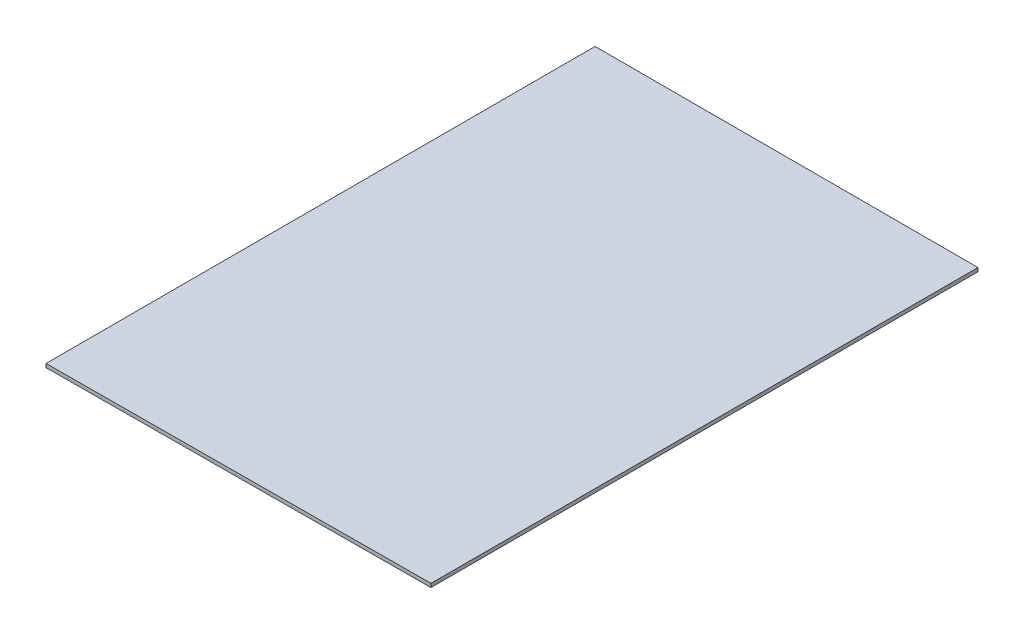
ISO-10303-21;
HEADER;
FILE_DESCRIPTION(('STEP AP214'),'2;1');
FILE_NAME('part.step','',(''),(''),'','','');
FILE_SCHEMA(('AUTOMOTIVE_DESIGN { 1 0 10303 214 1 1 1 1 }'));
ENDSEC;
DATA;
#1=APPLICATION_CONTEXT('core data for automotive mechanical design processes');
#2=APPLICATION_PROTOCOL_DEFINITION('international standard','automotive_design',2000,#1);
#3=PRODUCT_CONTEXT('',#1,'mechanical');
#4=PRODUCT('Part','Part','',(#3));
#5=PRODUCT_RELATED_PRODUCT_CATEGORY('part','',(#4));
#6=PRODUCT_DEFINITION_FORMATION('','',#4);
#7=PRODUCT_DEFINITION_CONTEXT('part definition',#1,'design');
#8=PRODUCT_DEFINITION('design','',#6,#7);
#9=PRODUCT_DEFINITION_SHAPE('','',#8);
#10=(LENGTH_UNIT() NAMED_UNIT(*) SI_UNIT(.MILLI.,.METRE.));
#11=(NAMED_UNIT(*) PLANE_ANGLE_UNIT() SI_UNIT($,.RADIAN.));
#12=(NAMED_UNIT(*) SI_UNIT($,.STERADIAN.) SOLID_ANGLE_UNIT());
#13=UNCERTAINTY_MEASURE_WITH_UNIT(LENGTH_MEASURE(1.E-05),#10,'distance_accuracy_value','');
#14=(GEOMETRIC_REPRESENTATION_CONTEXT(3) GLOBAL_UNCERTAINTY_ASSIGNED_CONTEXT((#13)) GLOBAL_UNIT_ASSIGNED_CONTEXT((#10,
#11,#12)) REPRESENTATION_CONTEXT('',''));
#15=CARTESIAN_POINT('',(0.,0.,0.));
#16=DIRECTION('',(0.,0.,1.));
#17=DIRECTION('',(1.,0.,0.));
#18=AXIS2_PLACEMENT_3D('',#15,#16,#17);
#19=CARTESIAN_POINT('',(-0.343304912611133,10.,-64.8870767216207));
#20=DIRECTION('',(-0.00529073160719021,0.,-0.999986003981586));
#21=DIRECTION('',(-0.999986003981586,0.,0.00529073160719021));
#22=AXIS2_PLACEMENT_3D('',#19,#20,#21);
#23=PLANE('',#22);
#24=DIRECTION('',(0.,1.,0.));
#25=VECTOR('',#24,1.);
#26=CARTESIAN_POINT('',(0.,10.,-64.8888930811945));
#27=LINE('',#26,#25);
#28=CARTESIAN_POINT('',(0.,10.,-64.8888930811945));
#29=VERTEX_POINT('',#28);
#30=CARTESIAN_POINT('',(0.,10.2,-64.8888930811945));
#31=VERTEX_POINT('',#30);
#32=EDGE_CURVE('E11',#29,#31,#27,.T.);
#33=ORIENTED_EDGE('',*,*,#32,.F.);
#34=DIRECTION('',(-0.999986003981586,0.,0.00529073160719021));
#35=VECTOR('',#34,1.);
#36=CARTESIAN_POINT('',(-0.343304912611133,10.,-64.8870767216207));
#37=LINE('',#36,#35);
#38=CARTESIAN_POINT('',(21.,10.,-65.));
#39=VERTEX_POINT('',#38);
#40=EDGE_CURVE('E88',#39,#29,#37,.T.);
#41=ORIENTED_EDGE('',*,*,#40,.F.);
#42=DIRECTION('',(0.,1.,0.));
#43=VECTOR('',#42,1.);
#44=CARTESIAN_POINT('',(21.,10.,-65.));
#45=LINE('',#44,#43);
#46=CARTESIAN_POINT('',(21.,10.2,-65.));
#47=VERTEX_POINT('',#46);
#48=EDGE_CURVE('E43',#39,#47,#45,.T.);
#49=ORIENTED_EDGE('',*,*,#48,.T.);
#50=DIRECTION('',(-0.999986003981586,0.,0.00529073160719021));
#51=VECTOR('',#50,1.);
#52=CARTESIAN_POINT('',(-0.343304912611133,10.2,-64.8870767216207));
#53=LINE('',#52,#51);
#54=EDGE_CURVE('E101',#47,#31,#53,.T.);
#55=ORIENTED_EDGE('',*,*,#54,.T.);
#56=EDGE_LOOP('',(#33,#41,#49,#55));
#57=FACE_BOUND('',#56,.T.);
#58=ADVANCED_FACE('F33',(#57),#23,.F.);
#59=CARTESIAN_POINT('',(21.,10.,0.));
#60=DIRECTION('',(-1.,0.,0.));
#61=DIRECTION('',(0.,0.,1.));
#62=AXIS2_PLACEMENT_3D('',#59,#60,#61);
#63=PLANE('',#62);
#64=ORIENTED_EDGE('',*,*,#48,.F.);
#65=DIRECTION('',(0.,0.,1.));
#66=VECTOR('',#65,1.);
#67=CARTESIAN_POINT('',(21.,10.,0.));
#68=LINE('',#67,#66);
#69=CARTESIAN_POINT('',(21.,10.,-95.));
#70=VERTEX_POINT('',#69);
#71=EDGE_CURVE('E95',#39,#70,#68,.F.);
#72=ORIENTED_EDGE('',*,*,#71,.T.);
#73=DIRECTION('',(0.,1.,0.));
#74=VECTOR('',#73,1.);
#75=CARTESIAN_POINT('',(21.,10.,-95.));
#76=LINE('',#75,#74);
#77=CARTESIAN_POINT('',(21.,10.2,-95.));
#78=VERTEX_POINT('',#77);
#79=EDGE_CURVE('E51',#70,#78,#76,.T.);
#80=ORIENTED_EDGE('',*,*,#79,.T.);
#81=DIRECTION('',(0.,0.,1.));
#82=VECTOR('',#81,1.);
#83=CARTESIAN_POINT('',(21.,10.2,0.));
#84=LINE('',#83,#82);
#85=EDGE_CURVE('E82',#47,#78,#84,.F.);
#86=ORIENTED_EDGE('',*,*,#85,.F.);
#87=EDGE_LOOP('',(#64,#72,#80,#86));
#88=FACE_BOUND('',#87,.T.);
#89=ADVANCED_FACE('F105',(#88),#63,.F.);
#90=CARTESIAN_POINT('',(0.,10.,-95.));
#91=DIRECTION('',(0.,0.,1.));
#92=DIRECTION('',(1.,0.,0.));
#93=AXIS2_PLACEMENT_3D('',#90,#91,#92);
#94=PLANE('',#93);
#95=ORIENTED_EDGE('',*,*,#79,.F.);
#96=DIRECTION('',(1.,0.,0.));
#97=VECTOR('',#96,1.);
#98=CARTESIAN_POINT('',(0.,10.,-95.));
#99=LINE('',#98,#97);
#100=CARTESIAN_POINT('',(0.,10.,-95.));
#101=VERTEX_POINT('',#100);
#102=EDGE_CURVE('E87',#70,#101,#99,.F.);
#103=ORIENTED_EDGE('',*,*,#102,.T.);
#104=DIRECTION('',(0.,1.,0.));
#105=VECTOR('',#104,1.);
#106=CARTESIAN_POINT('',(0.,10.,-95.));
#107=LINE('',#106,#105);
#108=CARTESIAN_POINT('',(0.,10.2,-95.));
#109=VERTEX_POINT('',#108);
#110=EDGE_CURVE('E37',#101,#109,#107,.T.);
#111=ORIENTED_EDGE('',*,*,#110,.T.);
#112=DIRECTION('',(1.,0.,0.));
#113=VECTOR('',#112,1.);
#114=CARTESIAN_POINT('',(0.,10.2,-95.));
#115=LINE('',#114,#113);
#116=EDGE_CURVE('E97',#78,#109,#115,.F.);
#117=ORIENTED_EDGE('',*,*,#116,.F.);
#118=EDGE_LOOP('',(#95,#103,#111,#117));
#119=FACE_BOUND('',#118,.T.);
#120=ADVANCED_FACE('F90',(#119),#94,.F.);
#121=CARTESIAN_POINT('',(0.,10.,0.));
#122=DIRECTION('',(-1.,0.,0.));
#123=DIRECTION('',(0.,0.,1.));
#124=AXIS2_PLACEMENT_3D('',#121,#122,#123);
#125=PLANE('',#124);
#126=DIRECTION('',(0.,0.,1.));
#127=VECTOR('',#126,1.);
#128=CARTESIAN_POINT('',(0.,10.,0.));
#129=LINE('',#128,#127);
#130=EDGE_CURVE('E76',#101,#29,#129,.T.);
#131=ORIENTED_EDGE('',*,*,#130,.T.);
#132=ORIENTED_EDGE('',*,*,#32,.T.);
#133=DIRECTION('',(0.,0.,1.));
#134=VECTOR('',#133,1.);
#135=CARTESIAN_POINT('',(0.,10.2,0.));
#136=LINE('',#135,#134);
#137=EDGE_CURVE('E78',#109,#31,#136,.T.);
#138=ORIENTED_EDGE('',*,*,#137,.F.);
#139=ORIENTED_EDGE('',*,*,#110,.F.);
#140=EDGE_LOOP('',(#131,#132,#138,#139));
#141=FACE_BOUND('',#140,.T.);
#142=ADVANCED_FACE('F35',(#141),#125,.T.);
#143=CARTESIAN_POINT('',(0.,10.2,0.));
#144=DIRECTION('',(0.,1.,0.));
#145=DIRECTION('',(0.,0.,1.));
#146=AXIS2_PLACEMENT_3D('',#143,#144,#145);
#147=PLANE('',#146);
#148=ORIENTED_EDGE('',*,*,#116,.T.);
#149=ORIENTED_EDGE('',*,*,#137,.T.);
#150=ORIENTED_EDGE('',*,*,#54,.F.);
#151=ORIENTED_EDGE('',*,*,#85,.T.);
#152=EDGE_LOOP('',(#148,#149,#150,#151));
#153=FACE_BOUND('',#152,.T.);
#154=ADVANCED_FACE('F104',(#153),#147,.T.);
#155=CARTESIAN_POINT('',(0.,10.,0.));
#156=DIRECTION('',(0.,1.,0.));
#157=DIRECTION('',(0.,0.,1.));
#158=AXIS2_PLACEMENT_3D('',#155,#156,#157);
#159=PLANE('',#158);
#160=ORIENTED_EDGE('',*,*,#102,.F.);
#161=ORIENTED_EDGE('',*,*,#71,.F.);
#162=ORIENTED_EDGE('',*,*,#40,.T.);
#163=ORIENTED_EDGE('',*,*,#130,.F.);
#164=EDGE_LOOP('',(#160,#161,#162,#163));
#165=FACE_BOUND('',#164,.T.);
#166=ADVANCED_FACE('F85',(#165),#159,.F.);
#167=CLOSED_SHELL('',(#58,#89,#120,#142,#154,#166));
#168=MANIFOLD_SOLID_BREP('B2',#167);
#169=ADVANCED_BREP_SHAPE_REPRESENTATION('',(#18,#168),#14);
#170=SHAPE_DEFINITION_REPRESENTATION(#9,#169);
ENDSEC;
END-ISO-10303-21;
